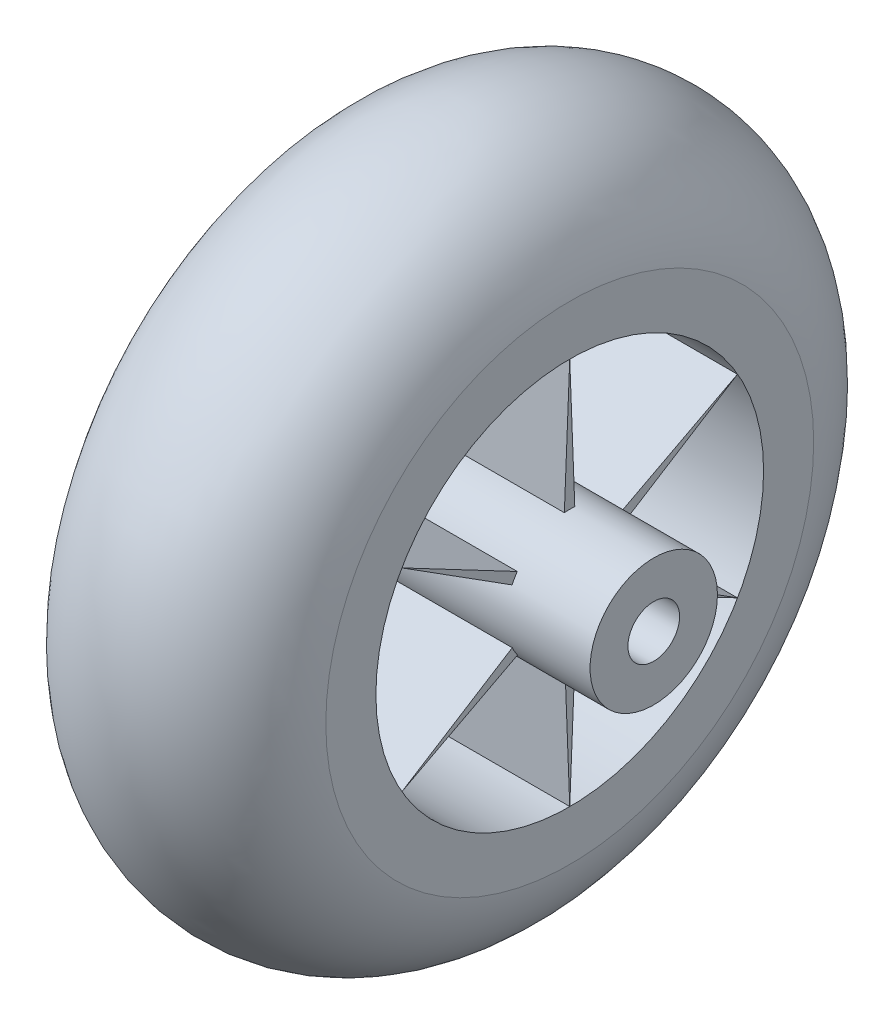
ISO-10303-21;
HEADER;
FILE_DESCRIPTION(('STEP AP214'),'2;1');
FILE_NAME('part.step','',(''),(''),'','','');
FILE_SCHEMA(('AUTOMOTIVE_DESIGN { 1 0 10303 214 1 1 1 1 }'));
ENDSEC;
DATA;
#1=APPLICATION_CONTEXT('core data for automotive mechanical design processes');
#2=APPLICATION_PROTOCOL_DEFINITION('international standard','automotive_design',2000,#1);
#3=PRODUCT_CONTEXT('',#1,'mechanical');
#4=PRODUCT('Part','Part','',(#3));
#5=PRODUCT_RELATED_PRODUCT_CATEGORY('part','',(#4));
#6=PRODUCT_DEFINITION_FORMATION('','',#4);
#7=PRODUCT_DEFINITION_CONTEXT('part definition',#1,'design');
#8=PRODUCT_DEFINITION('design','',#6,#7);
#9=PRODUCT_DEFINITION_SHAPE('','',#8);
#10=(LENGTH_UNIT() NAMED_UNIT(*) SI_UNIT(.MILLI.,.METRE.));
#11=(NAMED_UNIT(*) PLANE_ANGLE_UNIT() SI_UNIT($,.RADIAN.));
#12=(NAMED_UNIT(*) SI_UNIT($,.STERADIAN.) SOLID_ANGLE_UNIT());
#13=UNCERTAINTY_MEASURE_WITH_UNIT(LENGTH_MEASURE(1.E-05),#10,'distance_accuracy_value','');
#14=(GEOMETRIC_REPRESENTATION_CONTEXT(3) GLOBAL_UNCERTAINTY_ASSIGNED_CONTEXT((#13)) GLOBAL_UNIT_ASSIGNED_CONTEXT((#10,
#11,#12)) REPRESENTATION_CONTEXT('',''));
#15=CARTESIAN_POINT('',(0.,0.,0.));
#16=DIRECTION('',(0.,0.,1.));
#17=DIRECTION('',(1.,0.,0.));
#18=AXIS2_PLACEMENT_3D('',#15,#16,#17);
#19=CARTESIAN_POINT('',(0.,-21.,0.));
#20=DIRECTION('',(1.,0.,0.));
#21=DIRECTION('',(0.,0.,-1.));
#22=AXIS2_PLACEMENT_3D('',#19,#20,#21);
#23=CYLINDRICAL_SURFACE('',#22,6.9);
#24=DIRECTION('',(1.,0.,0.));
#25=VECTOR('',#24,1.);
#26=CARTESIAN_POINT('',(0.,-17.0879090937191,5.6837966836433));
#27=LINE('',#26,#25);
#28=CARTESIAN_POINT('',(26.6,-17.0879090937191,5.6837966836433));
#29=VERTEX_POINT('',#28);
#30=CARTESIAN_POINT('',(0.,-17.0879090937191,5.6837966836433));
#31=VERTEX_POINT('',#30);
#32=EDGE_CURVE('E179',#29,#31,#27,.F.);
#33=ORIENTED_EDGE('',*,*,#32,.F.);
#34=CARTESIAN_POINT('',(26.6,-21.,0.));
#35=DIRECTION('',(-1.,0.,0.));
#36=DIRECTION('',(0.,0.,1.));
#37=AXIS2_PLACEMENT_3D('',#34,#35,#36);
#38=CIRCLE('',#37,6.9);
#39=CARTESIAN_POINT('',(26.6,-18.0686754302461,6.24638585637784));
#40=VERTEX_POINT('',#39);
#41=EDGE_CURVE('E12',#29,#40,#38,.F.);
#42=ORIENTED_EDGE('',*,*,#41,.T.);
#43=DIRECTION('',(1.,0.,0.));
#44=VECTOR('',#43,1.);
#45=CARTESIAN_POINT('',(0.,-18.0686754302461,6.24638585637784));
#46=LINE('',#45,#44);
#47=CARTESIAN_POINT('',(0.,-18.0686754302461,6.24638585637784));
#48=VERTEX_POINT('',#47);
#49=EDGE_CURVE('E189',#48,#40,#46,.T.);
#50=ORIENTED_EDGE('',*,*,#49,.F.);
#51=CARTESIAN_POINT('',(0.,-21.,0.));
#52=DIRECTION('',(1.,0.,0.));
#53=DIRECTION('',(0.,0.,-1.));
#54=AXIS2_PLACEMENT_3D('',#51,#52,#53);
#55=CIRCLE('',#54,6.9);
#56=CARTESIAN_POINT('',(0.,-23.9662668648404,6.22986844857496));
#57=VERTEX_POINT('',#56);
#58=EDGE_CURVE('E194',#48,#57,#55,.T.);
#59=ORIENTED_EDGE('',*,*,#58,.T.);
#60=DIRECTION('',(1.,0.,0.));
#61=VECTOR('',#60,1.);
#62=CARTESIAN_POINT('',(0.,-23.9662668648404,6.22986844857496));
#63=LINE('',#62,#61);
#64=CARTESIAN_POINT('',(26.6,-23.9662668648404,6.22986844857496));
#65=VERTEX_POINT('',#64);
#66=EDGE_CURVE('E214',#65,#57,#63,.F.);
#67=ORIENTED_EDGE('',*,*,#66,.F.);
#68=CARTESIAN_POINT('',(26.6,-21.,0.));
#69=DIRECTION('',(-1.,0.,0.));
#70=DIRECTION('',(0.,0.,1.));
#71=AXIS2_PLACEMENT_3D('',#68,#69,#70);
#72=CIRCLE('',#71,6.9);
#73=CARTESIAN_POINT('',(26.6,-24.9438665485861,5.66179447233328));
#74=VERTEX_POINT('',#73);
#75=EDGE_CURVE('E56',#65,#74,#72,.F.);
#76=ORIENTED_EDGE('',*,*,#75,.T.);
#77=DIRECTION('',(1.,0.,0.));
#78=VECTOR('',#77,1.);
#79=CARTESIAN_POINT('',(0.,-24.9438665485861,5.66179447233328));
#80=LINE('',#79,#78);
#81=CARTESIAN_POINT('',(0.,-24.9438665485861,5.66179447233328));
#82=VERTEX_POINT('',#81);
#83=EDGE_CURVE('E212',#82,#74,#80,.T.);
#84=ORIENTED_EDGE('',*,*,#83,.F.);
#85=CARTESIAN_POINT('',(0.,-27.8783577711213,0.546071764931592));
#86=VERTEX_POINT('',#85);
#87=EDGE_CURVE('E323',#82,#86,#55,.T.);
#88=ORIENTED_EDGE('',*,*,#87,.T.);
#89=DIRECTION('',(1.,0.,0.));
#90=VECTOR('',#89,1.);
#91=CARTESIAN_POINT('',(0.,-27.8783577711213,0.546071764931592));
#92=LINE('',#91,#90);
#93=CARTESIAN_POINT('',(26.6,-27.8783577711213,0.546071764931592));
#94=VERTEX_POINT('',#93);
#95=EDGE_CURVE('E231',#94,#86,#92,.F.);
#96=ORIENTED_EDGE('',*,*,#95,.F.);
#97=CARTESIAN_POINT('',(26.6,-21.,0.));
#98=DIRECTION('',(-1.,0.,0.));
#99=DIRECTION('',(0.,0.,1.));
#100=AXIS2_PLACEMENT_3D('',#97,#98,#99);
#101=CIRCLE('',#100,6.9);
#102=CARTESIAN_POINT('',(26.6,-27.87519111834,-0.584591384044622));
#103=VERTEX_POINT('',#102);
#104=EDGE_CURVE('E306',#94,#103,#101,.F.);
#105=ORIENTED_EDGE('',*,*,#104,.T.);
#106=DIRECTION('',(1.,0.,0.));
#107=VECTOR('',#106,1.);
#108=CARTESIAN_POINT('',(0.,-27.87519111834,-0.584591384044622));
#109=LINE('',#108,#107);
#110=CARTESIAN_POINT('',(0.,-27.87519111834,-0.584591384044622));
#111=VERTEX_POINT('',#110);
#112=EDGE_CURVE('E228',#111,#103,#109,.T.);
#113=ORIENTED_EDGE('',*,*,#112,.F.);
#114=CARTESIAN_POINT('',(0.,-24.9120909062808,-5.68379668364332));
#115=VERTEX_POINT('',#114);
#116=EDGE_CURVE('E326',#111,#115,#55,.T.);
#117=ORIENTED_EDGE('',*,*,#116,.T.);
#118=DIRECTION('',(1.,0.,0.));
#119=VECTOR('',#118,1.);
#120=CARTESIAN_POINT('',(0.,-24.9120909062808,-5.68379668364332));
#121=LINE('',#120,#119);
#122=CARTESIAN_POINT('',(26.6,-24.9120909062808,-5.68379668364332));
#123=VERTEX_POINT('',#122);
#124=EDGE_CURVE('E248',#123,#115,#121,.F.);
#125=ORIENTED_EDGE('',*,*,#124,.F.);
#126=CARTESIAN_POINT('',(26.6,-21.,0.));
#127=DIRECTION('',(-1.,0.,0.));
#128=DIRECTION('',(0.,0.,1.));
#129=AXIS2_PLACEMENT_3D('',#126,#127,#128);
#130=CIRCLE('',#129,6.9);
#131=CARTESIAN_POINT('',(26.6,-23.9313245697539,-6.24638585637786));
#132=VERTEX_POINT('',#131);
#133=EDGE_CURVE('E303',#123,#132,#130,.F.);
#134=ORIENTED_EDGE('',*,*,#133,.T.);
#135=DIRECTION('',(1.,0.,0.));
#136=VECTOR('',#135,1.);
#137=CARTESIAN_POINT('',(0.,-23.9313245697539,-6.24638585637785));
#138=LINE('',#137,#136);
#139=CARTESIAN_POINT('',(0.,-23.9313245697539,-6.24638585637785));
#140=VERTEX_POINT('',#139);
#141=EDGE_CURVE('E245',#140,#132,#138,.T.);
#142=ORIENTED_EDGE('',*,*,#141,.F.);
#143=CARTESIAN_POINT('',(0.,-18.0337331351595,-6.22986844857494));
#144=VERTEX_POINT('',#143);
#145=EDGE_CURVE('E327',#140,#144,#55,.T.);
#146=ORIENTED_EDGE('',*,*,#145,.T.);
#147=DIRECTION('',(1.,0.,0.));
#148=VECTOR('',#147,1.);
#149=CARTESIAN_POINT('',(0.,-18.0337331351595,-6.22986844857494));
#150=LINE('',#149,#148);
#151=CARTESIAN_POINT('',(26.6,-18.0337331351595,-6.22986844857494));
#152=VERTEX_POINT('',#151);
#153=EDGE_CURVE('E265',#152,#144,#150,.F.);
#154=ORIENTED_EDGE('',*,*,#153,.F.);
#155=CARTESIAN_POINT('',(26.6,-21.,0.));
#156=DIRECTION('',(-1.,0.,0.));
#157=DIRECTION('',(0.,0.,1.));
#158=AXIS2_PLACEMENT_3D('',#155,#156,#157);
#159=CIRCLE('',#158,6.9);
#160=CARTESIAN_POINT('',(26.6,-17.0561334514139,-5.66179447233326));
#161=VERTEX_POINT('',#160);
#162=EDGE_CURVE('E300',#152,#161,#159,.F.);
#163=ORIENTED_EDGE('',*,*,#162,.T.);
#164=DIRECTION('',(1.,0.,0.));
#165=VECTOR('',#164,1.);
#166=CARTESIAN_POINT('',(0.,-17.0561334514139,-5.66179447233326));
#167=LINE('',#166,#165);
#168=CARTESIAN_POINT('',(0.,-17.0561334514139,-5.66179447233326));
#169=VERTEX_POINT('',#168);
#170=EDGE_CURVE('E262',#169,#161,#167,.T.);
#171=ORIENTED_EDGE('',*,*,#170,.F.);
#172=CARTESIAN_POINT('',(0.,-14.1216422288787,-0.546071764931592));
#173=VERTEX_POINT('',#172);
#174=EDGE_CURVE('E294',#169,#173,#55,.T.);
#175=ORIENTED_EDGE('',*,*,#174,.T.);
#176=DIRECTION('',(1.,0.,0.));
#177=VECTOR('',#176,1.);
#178=CARTESIAN_POINT('',(0.,-14.1216422288787,-0.546071764931592));
#179=LINE('',#178,#177);
#180=CARTESIAN_POINT('',(26.6,-14.1216422288787,-0.546071764931592));
#181=VERTEX_POINT('',#180);
#182=EDGE_CURVE('E282',#181,#173,#179,.F.);
#183=ORIENTED_EDGE('',*,*,#182,.F.);
#184=CARTESIAN_POINT('',(26.6,-21.,0.));
#185=DIRECTION('',(-1.,0.,0.));
#186=DIRECTION('',(0.,0.,1.));
#187=AXIS2_PLACEMENT_3D('',#184,#185,#186);
#188=CIRCLE('',#187,6.9);
#189=CARTESIAN_POINT('',(26.6,-14.12480888166,0.584591384044622));
#190=VERTEX_POINT('',#189);
#191=EDGE_CURVE('E297',#181,#190,#188,.F.);
#192=ORIENTED_EDGE('',*,*,#191,.T.);
#193=DIRECTION('',(1.,0.,0.));
#194=VECTOR('',#193,1.);
#195=CARTESIAN_POINT('',(0.,-14.12480888166,0.584591384044622));
#196=LINE('',#195,#194);
#197=CARTESIAN_POINT('',(0.,-14.12480888166,0.584591384044622));
#198=VERTEX_POINT('',#197);
#199=EDGE_CURVE('E279',#198,#190,#196,.T.);
#200=ORIENTED_EDGE('',*,*,#199,.F.);
#201=EDGE_CURVE('E295',#198,#31,#55,.T.);
#202=ORIENTED_EDGE('',*,*,#201,.T.);
#203=EDGE_LOOP('',(#33,#42,#50,#59,#67,#76,#84,#88,#96,#105,#113,#117,#125,#134,#142,#146,#154,
#163,#171,#175,#183,#192,#200,#202));
#204=FACE_BOUND('',#203,.T.);
#205=CARTESIAN_POINT('',(35.7,-21.,0.));
#206=DIRECTION('',(1.,0.,0.));
#207=DIRECTION('',(0.,0.,-1.));
#208=AXIS2_PLACEMENT_3D('',#205,#206,#207);
#209=CIRCLE('',#208,6.9);
#210=CARTESIAN_POINT('',(35.7,-21.,-6.9));
#211=VERTEX_POINT('',#210);
#212=EDGE_CURVE('E289',#211,#211,#209,.T.);
#213=ORIENTED_EDGE('',*,*,#212,.F.);
#214=EDGE_LOOP('',(#213));
#215=FACE_BOUND('',#214,.T.);
#216=ADVANCED_FACE('F49',(#204,#215),#23,.T.);
#217=CARTESIAN_POINT('',(0.,-21.,0.));
#218=DIRECTION('',(1.,0.,0.));
#219=DIRECTION('',(0.,0.,-1.));
#220=AXIS2_PLACEMENT_3D('',#217,#218,#219);
#221=PLANE('',#220);
#222=ORIENTED_EDGE('',*,*,#58,.F.);
#223=DIRECTION('',(0.,-0.535384337110098,-0.844608555235608));
#224=VECTOR('',#223,1.);
#225=CARTESIAN_POINT('',(0.,-10.4999999999998,18.1865334794731));
#226=LINE('',#225,#224);
#227=CARTESIAN_POINT('',(0.,-10.4999999999998,18.1865334794731));
#228=VERTEX_POINT('',#227);
#229=EDGE_CURVE('E184',#228,#48,#226,.T.);
#230=ORIENTED_EDGE('',*,*,#229,.F.);
#231=DIRECTION('',(0.,0.466163144891677,0.88469877491986));
#232=VECTOR('',#231,1.);
#233=CARTESIAN_POINT('',(0.,-10.4999999999998,18.1865334794731));
#234=LINE('',#233,#232);
#235=EDGE_CURVE('E173',#31,#228,#234,.T.);
#236=ORIENTED_EDGE('',*,*,#235,.F.);
#237=ORIENTED_EDGE('',*,*,#201,.F.);
#238=DIRECTION('',(0.,-0.999144633642758,0.0413521591078215));
#239=VECTOR('',#238,1.);
#240=CARTESIAN_POINT('',(0.,0.,0.));
#241=LINE('',#240,#239);
#242=CARTESIAN_POINT('',(0.,0.,0.));
#243=VERTEX_POINT('',#242);
#244=EDGE_CURVE('E271',#243,#198,#241,.T.);
#245=ORIENTED_EDGE('',*,*,#244,.F.);
#246=DIRECTION('',(0.,0.999253186223408,0.0386402616757032));
#247=VECTOR('',#246,1.);
#248=CARTESIAN_POINT('',(0.,0.,0.));
#249=LINE('',#248,#247);
#250=EDGE_CURVE('E269',#173,#243,#249,.T.);
#251=ORIENTED_EDGE('',*,*,#250,.F.);
#252=ORIENTED_EDGE('',*,*,#174,.F.);
#253=DIRECTION('',(0.,-0.463760296532668,0.885960714343437));
#254=VECTOR('',#253,1.);
#255=CARTESIAN_POINT('',(0.,-10.5,-18.1865334794732));
#256=LINE('',#255,#254);
#257=CARTESIAN_POINT('',(0.,-10.5,-18.1865334794732));
#258=VERTEX_POINT('',#257);
#259=EDGE_CURVE('E254',#258,#169,#256,.T.);
#260=ORIENTED_EDGE('',*,*,#259,.F.);
#261=DIRECTION('',(0.,0.533090041331739,-0.846058513244164));
#262=VECTOR('',#261,1.);
#263=CARTESIAN_POINT('',(0.,-10.5,-18.1865334794732));
#264=LINE('',#263,#262);
#265=EDGE_CURVE('E252',#144,#258,#264,.T.);
#266=ORIENTED_EDGE('',*,*,#265,.F.);
#267=ORIENTED_EDGE('',*,*,#145,.F.);
#268=DIRECTION('',(0.,0.535384337110093,0.844608555235612));
#269=VECTOR('',#268,1.);
#270=CARTESIAN_POINT('',(0.,-31.5000000000001,-18.1865334794732));
#271=LINE('',#270,#269);
#272=CARTESIAN_POINT('',(0.,-31.5000000000001,-18.1865334794732));
#273=VERTEX_POINT('',#272);
#274=EDGE_CURVE('E237',#273,#140,#271,.T.);
#275=ORIENTED_EDGE('',*,*,#274,.F.);
#276=DIRECTION('',(0.,-0.466163144891671,-0.884698774919863));
#277=VECTOR('',#276,1.);
#278=CARTESIAN_POINT('',(0.,-31.5000000000001,-18.1865334794732));
#279=LINE('',#278,#277);
#280=EDGE_CURVE('E235',#115,#273,#279,.T.);
#281=ORIENTED_EDGE('',*,*,#280,.F.);
#282=ORIENTED_EDGE('',*,*,#116,.F.);
#283=DIRECTION('',(0.,0.999144633642758,-0.0413521591078215));
#284=VECTOR('',#283,1.);
#285=CARTESIAN_POINT('',(0.,-42.,0.));
#286=LINE('',#285,#284);
#287=CARTESIAN_POINT('',(0.,-42.,0.));
#288=VERTEX_POINT('',#287);
#289=EDGE_CURVE('E220',#288,#111,#286,.T.);
#290=ORIENTED_EDGE('',*,*,#289,.F.);
#291=DIRECTION('',(0.,-0.999253186223408,-0.0386402616757032));
#292=VECTOR('',#291,1.);
#293=CARTESIAN_POINT('',(0.,-42.,0.));
#294=LINE('',#293,#292);
#295=EDGE_CURVE('E218',#86,#288,#294,.T.);
#296=ORIENTED_EDGE('',*,*,#295,.F.);
#297=ORIENTED_EDGE('',*,*,#87,.F.);
#298=DIRECTION('',(0.,0.463760296532661,-0.88596071434344));
#299=VECTOR('',#298,1.);
#300=CARTESIAN_POINT('',(0.,-31.4999999999998,18.1865334794733));
#301=LINE('',#300,#299);
#302=CARTESIAN_POINT('',(0.,-31.4999999999998,18.1865334794733));
#303=VERTEX_POINT('',#302);
#304=EDGE_CURVE('E205',#303,#82,#301,.T.);
#305=ORIENTED_EDGE('',*,*,#304,.F.);
#306=DIRECTION('',(0.,-0.533090041331733,0.846058513244167));
#307=VECTOR('',#306,1.);
#308=CARTESIAN_POINT('',(0.,-31.4999999999998,18.1865334794733));
#309=LINE('',#308,#307);
#310=EDGE_CURVE('E203',#57,#303,#309,.T.);
#311=ORIENTED_EDGE('',*,*,#310,.F.);
#312=EDGE_LOOP('',(#222,#230,#236,#237,#245,#251,#252,#260,#266,#267,#275,#281,#282,#290,#296,
#297,#305,#311));
#313=FACE_BOUND('',#312,.T.);
#314=ADVANCED_FACE('F192',(#313),#221,.F.);
#315=CARTESIAN_POINT('',(35.7,-21.,0.));
#316=DIRECTION('',(1.,0.,0.));
#317=DIRECTION('',(0.,0.,-1.));
#318=AXIS2_PLACEMENT_3D('',#315,#316,#317);
#319=PLANE('',#318);
#320=CARTESIAN_POINT('',(35.7,-21.,0.));
#321=DIRECTION('',(1.,0.,0.));
#322=DIRECTION('',(0.,0.,-1.));
#323=AXIS2_PLACEMENT_3D('',#320,#321,#322);
#324=CIRCLE('',#323,2.8);
#325=CARTESIAN_POINT('',(35.7,-21.,-2.8));
#326=VERTEX_POINT('',#325);
#327=EDGE_CURVE('E285',#326,#326,#324,.T.);
#328=ORIENTED_EDGE('',*,*,#327,.F.);
#329=EDGE_LOOP('',(#328));
#330=FACE_BOUND('',#329,.T.);
#331=ORIENTED_EDGE('',*,*,#212,.T.);
#332=EDGE_LOOP('',(#331));
#333=FACE_BOUND('',#332,.T.);
#334=ADVANCED_FACE('F365',(#330,#333),#319,.T.);
#335=CARTESIAN_POINT('',(26.6,-21.,0.));
#336=DIRECTION('',(1.,0.,0.));
#337=DIRECTION('',(0.,0.,-1.));
#338=AXIS2_PLACEMENT_3D('',#335,#336,#337);
#339=CYLINDRICAL_SURFACE('',#338,2.8);
#340=CARTESIAN_POINT('',(26.6,-21.,0.));
#341=DIRECTION('',(1.,0.,0.));
#342=DIRECTION('',(0.,0.,-1.));
#343=AXIS2_PLACEMENT_3D('',#340,#341,#342);
#344=CIRCLE('',#343,2.8);
#345=CARTESIAN_POINT('',(26.6,-21.,-2.8));
#346=VERTEX_POINT('',#345);
#347=EDGE_CURVE('E286',#346,#346,#344,.T.);
#348=ORIENTED_EDGE('',*,*,#347,.F.);
#349=EDGE_LOOP('',(#348));
#350=FACE_BOUND('',#349,.T.);
#351=ORIENTED_EDGE('',*,*,#327,.T.);
#352=EDGE_LOOP('',(#351));
#353=FACE_BOUND('',#352,.T.);
#354=ADVANCED_FACE('F369',(#350,#353),#339,.F.);
#355=CARTESIAN_POINT('',(26.6,-21.,0.));
#356=DIRECTION('',(1.,0.,0.));
#357=DIRECTION('',(0.,0.,-1.));
#358=AXIS2_PLACEMENT_3D('',#355,#356,#357);
#359=PLANE('',#358);
#360=ORIENTED_EDGE('',*,*,#347,.T.);
#361=EDGE_LOOP('',(#360));
#362=FACE_BOUND('',#361,.T.);
#363=ADVANCED_FACE('F375',(#362),#359,.T.);
#364=CARTESIAN_POINT('',(0.,0.,0.));
#365=DIRECTION('',(0.,0.0386402616757032,-0.999253186223408));
#366=DIRECTION('',(0.,0.999253186223408,0.0386402616757032));
#367=AXIS2_PLACEMENT_3D('',#364,#365,#366);
#368=PLANE('',#367);
#369=DIRECTION('',(0.,0.999253186223408,0.0386402616757032));
#370=VECTOR('',#369,1.);
#371=CARTESIAN_POINT('',(26.6,0.,0.));
#372=LINE('',#371,#370);
#373=CARTESIAN_POINT('',(26.6,0.,0.));
#374=VERTEX_POINT('',#373);
#375=EDGE_CURVE('E268',#181,#374,#372,.T.);
#376=ORIENTED_EDGE('',*,*,#375,.F.);
#377=ORIENTED_EDGE('',*,*,#182,.T.);
#378=ORIENTED_EDGE('',*,*,#250,.T.);
#379=DIRECTION('',(1.,0.,0.));
#380=VECTOR('',#379,1.);
#381=CARTESIAN_POINT('',(0.,0.,0.));
#382=LINE('',#381,#380);
#383=EDGE_CURVE('E274',#243,#374,#382,.T.);
#384=ORIENTED_EDGE('',*,*,#383,.T.);
#385=EDGE_LOOP('',(#376,#377,#378,#384));
#386=FACE_BOUND('',#385,.T.);
#387=ADVANCED_FACE('F341',(#386),#368,.T.);
#388=CARTESIAN_POINT('',(0.,0.,0.));
#389=DIRECTION('',(0.,0.0413521591078215,0.999144633642758));
#390=DIRECTION('',(0.,-0.999144633642758,0.0413521591078215));
#391=AXIS2_PLACEMENT_3D('',#388,#389,#390);
#392=PLANE('',#391);
#393=ORIENTED_EDGE('',*,*,#244,.T.);
#394=ORIENTED_EDGE('',*,*,#199,.T.);
#395=DIRECTION('',(0.,-0.999144633642758,0.0413521591078215));
#396=VECTOR('',#395,1.);
#397=CARTESIAN_POINT('',(26.6,0.,0.));
#398=LINE('',#397,#396);
#399=EDGE_CURVE('E272',#374,#190,#398,.T.);
#400=ORIENTED_EDGE('',*,*,#399,.F.);
#401=ORIENTED_EDGE('',*,*,#383,.F.);
#402=EDGE_LOOP('',(#393,#394,#400,#401));
#403=FACE_BOUND('',#402,.T.);
#404=ADVANCED_FACE('F346',(#403),#392,.T.);
#405=CARTESIAN_POINT('',(26.6,-20.7386595839758,0.0192438441195656));
#406=DIRECTION('',(-1.,0.,0.));
#407=DIRECTION('',(0.,0.,1.));
#408=AXIS2_PLACEMENT_3D('',#405,#406,#407);
#409=PLANE('',#408);
#410=ORIENTED_EDGE('',*,*,#191,.F.);
#411=ORIENTED_EDGE('',*,*,#375,.T.);
#412=ORIENTED_EDGE('',*,*,#399,.T.);
#413=EDGE_LOOP('',(#410,#411,#412));
#414=FACE_BOUND('',#413,.T.);
#415=ADVANCED_FACE('F349',(#414),#409,.F.);
#416=CARTESIAN_POINT('',(0.,-10.5,-18.1865334794732));
#417=DIRECTION('',(0.,-0.846058513244164,-0.533090041331739));
#418=DIRECTION('',(0.,0.533090041331739,-0.846058513244164));
#419=AXIS2_PLACEMENT_3D('',#416,#417,#418);
#420=PLANE('',#419);
#421=DIRECTION('',(0.,0.533090041331739,-0.846058513244164));
#422=VECTOR('',#421,1.);
#423=CARTESIAN_POINT('',(26.6,-10.5,-18.1865334794732));
#424=LINE('',#423,#422);
#425=CARTESIAN_POINT('',(26.6,-10.5,-18.1865334794732));
#426=VERTEX_POINT('',#425);
#427=EDGE_CURVE('E251',#152,#426,#424,.T.);
#428=ORIENTED_EDGE('',*,*,#427,.F.);
#429=ORIENTED_EDGE('',*,*,#153,.T.);
#430=ORIENTED_EDGE('',*,*,#265,.T.);
#431=DIRECTION('',(1.,0.,0.));
#432=VECTOR('',#431,1.);
#433=CARTESIAN_POINT('',(0.,-10.5,-18.1865334794732));
#434=LINE('',#433,#432);
#435=EDGE_CURVE('E257',#258,#426,#434,.T.);
#436=ORIENTED_EDGE('',*,*,#435,.T.);
#437=EDGE_LOOP('',(#428,#429,#430,#436));
#438=FACE_BOUND('',#437,.T.);
#439=ADVANCED_FACE('F351',(#438),#420,.T.);
#440=CARTESIAN_POINT('',(0.,-10.5,-18.1865334794732));
#441=DIRECTION('',(0.,0.885960714343436,0.463760296532668));
#442=DIRECTION('',(0.,-0.463760296532668,0.885960714343436));
#443=AXIS2_PLACEMENT_3D('',#440,#441,#442);
#444=PLANE('',#443);
#445=ORIENTED_EDGE('',*,*,#259,.T.);
#446=ORIENTED_EDGE('',*,*,#170,.T.);
#447=DIRECTION('',(0.,-0.463760296532668,0.885960714343437));
#448=VECTOR('',#447,1.);
#449=CARTESIAN_POINT('',(26.6,-10.5,-18.1865334794732));
#450=LINE('',#449,#448);
#451=EDGE_CURVE('E255',#426,#161,#450,.T.);
#452=ORIENTED_EDGE('',*,*,#451,.F.);
#453=ORIENTED_EDGE('',*,*,#435,.F.);
#454=EDGE_LOOP('',(#445,#446,#452,#453));
#455=FACE_BOUND('',#454,.T.);
#456=ADVANCED_FACE('F357',(#455),#444,.T.);
#457=CARTESIAN_POINT('',(26.6,-20.8526641341139,-0.216705517252787));
#458=DIRECTION('',(-1.,0.,0.));
#459=DIRECTION('',(0.,0.86602540378444,0.499999999999998));
#460=AXIS2_PLACEMENT_3D('',#457,#458,#459);
#461=PLANE('',#460);
#462=ORIENTED_EDGE('',*,*,#162,.F.);
#463=ORIENTED_EDGE('',*,*,#427,.T.);
#464=ORIENTED_EDGE('',*,*,#451,.T.);
#465=EDGE_LOOP('',(#462,#463,#464));
#466=FACE_BOUND('',#465,.T.);
#467=ADVANCED_FACE('F448',(#466),#461,.F.);
#468=CARTESIAN_POINT('',(0.,-31.5000000000001,-18.1865334794732));
#469=DIRECTION('',(0.,-0.884698774919863,0.466163144891671));
#470=DIRECTION('',(0.,-0.466163144891671,-0.884698774919863));
#471=AXIS2_PLACEMENT_3D('',#468,#469,#470);
#472=PLANE('',#471);
#473=DIRECTION('',(0.,-0.466163144891671,-0.884698774919863));
#474=VECTOR('',#473,1.);
#475=CARTESIAN_POINT('',(26.6,-31.5000000000001,-18.1865334794732));
#476=LINE('',#475,#474);
#477=CARTESIAN_POINT('',(26.6,-31.5000000000001,-18.1865334794732));
#478=VERTEX_POINT('',#477);
#479=EDGE_CURVE('E234',#123,#478,#476,.T.);
#480=ORIENTED_EDGE('',*,*,#479,.F.);
#481=ORIENTED_EDGE('',*,*,#124,.T.);
#482=ORIENTED_EDGE('',*,*,#280,.T.);
#483=DIRECTION('',(1.,0.,0.));
#484=VECTOR('',#483,1.);
#485=CARTESIAN_POINT('',(0.,-31.5000000000001,-18.1865334794732));
#486=LINE('',#485,#484);
#487=EDGE_CURVE('E240',#273,#478,#486,.T.);
#488=ORIENTED_EDGE('',*,*,#487,.T.);
#489=EDGE_LOOP('',(#480,#481,#482,#488));
#490=FACE_BOUND('',#489,.T.);
#491=ADVANCED_FACE('F443',(#490),#472,.T.);
#492=CARTESIAN_POINT('',(0.,-31.5000000000001,-18.1865334794732));
#493=DIRECTION('',(0.,0.844608555235612,-0.535384337110092));
#494=DIRECTION('',(0.,0.535384337110092,0.844608555235612));
#495=AXIS2_PLACEMENT_3D('',#492,#493,#494);
#496=PLANE('',#495);
#497=ORIENTED_EDGE('',*,*,#274,.T.);
#498=ORIENTED_EDGE('',*,*,#141,.T.);
#499=DIRECTION('',(0.,0.535384337110093,0.844608555235612));
#500=VECTOR('',#499,1.);
#501=CARTESIAN_POINT('',(26.6,-31.5000000000001,-18.1865334794732));
#502=LINE('',#501,#500);
#503=EDGE_CURVE('E238',#478,#132,#502,.T.);
#504=ORIENTED_EDGE('',*,*,#503,.F.);
#505=ORIENTED_EDGE('',*,*,#487,.F.);
#506=EDGE_LOOP('',(#497,#498,#504,#505));
#507=FACE_BOUND('',#506,.T.);
#508=ADVANCED_FACE('F447',(#507),#496,.T.);
#509=CARTESIAN_POINT('',(26.6,-21.1140045501381,-0.235949361372355));
#510=DIRECTION('',(-1.,0.,0.));
#511=DIRECTION('',(0.,0.866025403784436,-0.500000000000004));
#512=AXIS2_PLACEMENT_3D('',#509,#510,#511);
#513=PLANE('',#512);
#514=ORIENTED_EDGE('',*,*,#133,.F.);
#515=ORIENTED_EDGE('',*,*,#479,.T.);
#516=ORIENTED_EDGE('',*,*,#503,.T.);
#517=EDGE_LOOP('',(#514,#515,#516));
#518=FACE_BOUND('',#517,.T.);
#519=ADVANCED_FACE('F433',(#518),#513,.F.);
#520=CARTESIAN_POINT('',(0.,-42.,0.));
#521=DIRECTION('',(0.,-0.0386402616757032,0.999253186223408));
#522=DIRECTION('',(0.,-0.999253186223408,-0.0386402616757032));
#523=AXIS2_PLACEMENT_3D('',#520,#521,#522);
#524=PLANE('',#523);
#525=DIRECTION('',(0.,-0.999253186223408,-0.0386402616757032));
#526=VECTOR('',#525,1.);
#527=CARTESIAN_POINT('',(26.6,-42.,0.));
#528=LINE('',#527,#526);
#529=CARTESIAN_POINT('',(26.6,-42.,0.));
#530=VERTEX_POINT('',#529);
#531=EDGE_CURVE('E217',#94,#530,#528,.T.);
#532=ORIENTED_EDGE('',*,*,#531,.F.);
#533=ORIENTED_EDGE('',*,*,#95,.T.);
#534=ORIENTED_EDGE('',*,*,#295,.T.);
#535=DIRECTION('',(1.,0.,0.));
#536=VECTOR('',#535,1.);
#537=CARTESIAN_POINT('',(0.,-42.,0.));
#538=LINE('',#537,#536);
#539=EDGE_CURVE('E223',#288,#530,#538,.T.);
#540=ORIENTED_EDGE('',*,*,#539,.T.);
#541=EDGE_LOOP('',(#532,#533,#534,#540));
#542=FACE_BOUND('',#541,.T.);
#543=ADVANCED_FACE('F428',(#542),#524,.T.);
#544=CARTESIAN_POINT('',(0.,-42.,0.));
#545=DIRECTION('',(0.,-0.0413521591078215,-0.999144633642758));
#546=DIRECTION('',(0.,0.999144633642758,-0.0413521591078215));
#547=AXIS2_PLACEMENT_3D('',#544,#545,#546);
#548=PLANE('',#547);
#549=ORIENTED_EDGE('',*,*,#289,.T.);
#550=ORIENTED_EDGE('',*,*,#112,.T.);
#551=DIRECTION('',(0.,0.999144633642758,-0.0413521591078215));
#552=VECTOR('',#551,1.);
#553=CARTESIAN_POINT('',(26.6,-42.,0.));
#554=LINE('',#553,#552);
#555=EDGE_CURVE('E221',#530,#103,#554,.T.);
#556=ORIENTED_EDGE('',*,*,#555,.F.);
#557=ORIENTED_EDGE('',*,*,#539,.F.);
#558=EDGE_LOOP('',(#549,#550,#556,#557));
#559=FACE_BOUND('',#558,.T.);
#560=ADVANCED_FACE('F432',(#559),#548,.T.);
#561=CARTESIAN_POINT('',(26.6,-21.2613404160242,-0.0192438441195656));
#562=DIRECTION('',(-1.,0.,0.));
#563=DIRECTION('',(0.,0.,-1.));
#564=AXIS2_PLACEMENT_3D('',#561,#562,#563);
#565=PLANE('',#564);
#566=ORIENTED_EDGE('',*,*,#104,.F.);
#567=ORIENTED_EDGE('',*,*,#531,.T.);
#568=ORIENTED_EDGE('',*,*,#555,.T.);
#569=EDGE_LOOP('',(#566,#567,#568));
#570=FACE_BOUND('',#569,.T.);
#571=ADVANCED_FACE('F419',(#570),#565,.F.);
#572=CARTESIAN_POINT('',(0.,-31.4999999999998,18.1865334794733));
#573=DIRECTION('',(0.,0.846058513244167,0.533090041331733));
#574=DIRECTION('',(0.,-0.533090041331733,0.846058513244167));
#575=AXIS2_PLACEMENT_3D('',#572,#573,#574);
#576=PLANE('',#575);
#577=DIRECTION('',(0.,-0.533090041331733,0.846058513244167));
#578=VECTOR('',#577,1.);
#579=CARTESIAN_POINT('',(26.6,-31.4999999999998,18.1865334794733));
#580=LINE('',#579,#578);
#581=CARTESIAN_POINT('',(26.6,-31.4999999999998,18.1865334794733));
#582=VERTEX_POINT('',#581);
#583=EDGE_CURVE('E202',#65,#582,#580,.T.);
#584=ORIENTED_EDGE('',*,*,#583,.F.);
#585=ORIENTED_EDGE('',*,*,#66,.T.);
#586=ORIENTED_EDGE('',*,*,#310,.T.);
#587=DIRECTION('',(1.,0.,0.));
#588=VECTOR('',#587,1.);
#589=CARTESIAN_POINT('',(0.,-31.4999999999998,18.1865334794733));
#590=LINE('',#589,#588);
#591=EDGE_CURVE('E207',#303,#582,#590,.T.);
#592=ORIENTED_EDGE('',*,*,#591,.T.);
#593=EDGE_LOOP('',(#584,#585,#586,#592));
#594=FACE_BOUND('',#593,.T.);
#595=ADVANCED_FACE('F317',(#594),#576,.T.);
#596=CARTESIAN_POINT('',(0.,-31.4999999999998,18.1865334794733));
#597=DIRECTION('',(0.,-0.88596071434344,-0.463760296532661));
#598=DIRECTION('',(0.,0.463760296532661,-0.88596071434344));
#599=AXIS2_PLACEMENT_3D('',#596,#597,#598);
#600=PLANE('',#599);
#601=ORIENTED_EDGE('',*,*,#304,.T.);
#602=ORIENTED_EDGE('',*,*,#83,.T.);
#603=DIRECTION('',(0.,0.463760296532661,-0.88596071434344));
#604=VECTOR('',#603,1.);
#605=CARTESIAN_POINT('',(26.6,-31.4999999999998,18.1865334794733));
#606=LINE('',#605,#604);
#607=EDGE_CURVE('E71',#582,#74,#606,.T.);
#608=ORIENTED_EDGE('',*,*,#607,.F.);
#609=ORIENTED_EDGE('',*,*,#591,.F.);
#610=EDGE_LOOP('',(#601,#602,#608,#609));
#611=FACE_BOUND('',#610,.T.);
#612=ADVANCED_FACE('F321',(#611),#600,.T.);
#613=CARTESIAN_POINT('',(26.6,-21.1473358658861,0.21670551725279));
#614=DIRECTION('',(-1.,0.,0.));
#615=DIRECTION('',(0.,-0.866025403784443,-0.499999999999992));
#616=AXIS2_PLACEMENT_3D('',#613,#614,#615);
#617=PLANE('',#616);
#618=ORIENTED_EDGE('',*,*,#75,.F.);
#619=ORIENTED_EDGE('',*,*,#583,.T.);
#620=ORIENTED_EDGE('',*,*,#607,.T.);
#621=EDGE_LOOP('',(#618,#619,#620));
#622=FACE_BOUND('',#621,.T.);
#623=ADVANCED_FACE('F315',(#622),#617,.F.);
#624=CARTESIAN_POINT('',(0.,-10.4999999999998,18.1865334794731));
#625=DIRECTION('',(0.,0.88469877491986,-0.466163144891677));
#626=DIRECTION('',(0.,0.466163144891677,0.88469877491986));
#627=AXIS2_PLACEMENT_3D('',#624,#625,#626);
#628=PLANE('',#627);
#629=DIRECTION('',(0.,0.466163144891677,0.88469877491986));
#630=VECTOR('',#629,1.);
#631=CARTESIAN_POINT('',(26.6,-10.4999999999998,18.1865334794731));
#632=LINE('',#631,#630);
#633=CARTESIAN_POINT('',(26.6,-10.4999999999998,18.1865334794731));
#634=VERTEX_POINT('',#633);
#635=EDGE_CURVE('E197',#29,#634,#632,.T.);
#636=ORIENTED_EDGE('',*,*,#635,.F.);
#637=ORIENTED_EDGE('',*,*,#32,.T.);
#638=ORIENTED_EDGE('',*,*,#235,.T.);
#639=DIRECTION('',(1.,0.,0.));
#640=VECTOR('',#639,1.);
#641=CARTESIAN_POINT('',(0.,-10.4999999999998,18.1865334794731));
#642=LINE('',#641,#640);
#643=EDGE_CURVE('E177',#228,#634,#642,.T.);
#644=ORIENTED_EDGE('',*,*,#643,.T.);
#645=EDGE_LOOP('',(#636,#637,#638,#644));
#646=FACE_BOUND('',#645,.T.);
#647=ADVANCED_FACE('F176',(#646),#628,.T.);
#648=CARTESIAN_POINT('',(0.,-10.4999999999998,18.1865334794731));
#649=DIRECTION('',(0.,-0.844608555235608,0.535384337110098));
#650=DIRECTION('',(0.,-0.535384337110098,-0.844608555235608));
#651=AXIS2_PLACEMENT_3D('',#648,#649,#650);
#652=PLANE('',#651);
#653=ORIENTED_EDGE('',*,*,#229,.T.);
#654=ORIENTED_EDGE('',*,*,#49,.T.);
#655=DIRECTION('',(0.,-0.535384337110098,-0.844608555235608));
#656=VECTOR('',#655,1.);
#657=CARTESIAN_POINT('',(26.6,-10.4999999999998,18.1865334794731));
#658=LINE('',#657,#656);
#659=EDGE_CURVE('E63',#634,#40,#658,.T.);
#660=ORIENTED_EDGE('',*,*,#659,.F.);
#661=ORIENTED_EDGE('',*,*,#643,.F.);
#662=EDGE_LOOP('',(#653,#654,#660,#661));
#663=FACE_BOUND('',#662,.T.);
#664=ADVANCED_FACE('F187',(#663),#652,.T.);
#665=CARTESIAN_POINT('',(26.6,-20.8859954498619,0.235949361372355));
#666=DIRECTION('',(-1.,0.,0.));
#667=DIRECTION('',(0.,-0.866025403784433,0.50000000000001));
#668=AXIS2_PLACEMENT_3D('',#665,#666,#667);
#669=PLANE('',#668);
#670=ORIENTED_EDGE('',*,*,#41,.F.);
#671=ORIENTED_EDGE('',*,*,#635,.T.);
#672=ORIENTED_EDGE('',*,*,#659,.T.);
#673=EDGE_LOOP('',(#670,#671,#672));
#674=FACE_BOUND('',#673,.T.);
#675=ADVANCED_FACE('F406',(#674),#669,.F.);
#676=CLOSED_SHELL('',(#216,#314,#334,#354,#363,#387,#404,#415,#439,#456,#467,#491,#508,#519,
#543,#560,#571,#595,#612,#623,#647,#664,#675));
#677=MANIFOLD_SOLID_BREP('B2',#676);
#678=CARTESIAN_POINT('',(0.,0.,0.));
#679=DIRECTION('',(1.,0.,0.));
#680=DIRECTION('',(0.,0.,-1.));
#681=AXIS2_PLACEMENT_3D('',#678,#679,#680);
#682=PLANE('',#681);
#683=CARTESIAN_POINT('',(0.,-21.,0.));
#684=DIRECTION('',(-1.,0.,0.));
#685=DIRECTION('',(0.,0.,1.));
#686=AXIS2_PLACEMENT_3D('',#683,#684,#685);
#687=CIRCLE('',#686,21.);
#688=CARTESIAN_POINT('',(0.,-21.,21.));
#689=VERTEX_POINT('',#688);
#690=EDGE_CURVE('E654',#689,#689,#687,.T.);
#691=ORIENTED_EDGE('',*,*,#690,.F.);
#692=EDGE_LOOP('',(#691));
#693=FACE_BOUND('',#692,.T.);
#694=CARTESIAN_POINT('',(0.,-21.,0.));
#695=DIRECTION('',(-1.,0.,0.));
#696=DIRECTION('',(0.,0.,1.));
#697=AXIS2_PLACEMENT_3D('',#694,#695,#696);
#698=CIRCLE('',#697,26.4255237272436);
#699=CARTESIAN_POINT('',(0.,-21.,26.4255237272436));
#700=VERTEX_POINT('',#699);
#701=EDGE_CURVE('E48',#700,#700,#698,.T.);
#702=ORIENTED_EDGE('',*,*,#701,.T.);
#703=EDGE_LOOP('',(#702));
#704=FACE_BOUND('',#703,.T.);
#705=ADVANCED_FACE('F637',(#693,#704),#682,.F.);
#706=CARTESIAN_POINT('',(13.3,-21.,0.));
#707=DIRECTION('',(-1.,0.,0.));
#708=DIRECTION('',(0.,0.,1.));
#709=AXIS2_PLACEMENT_3D('',#706,#707,#708);
#710=TOROIDAL_SURFACE('',#709,24.3685685000515,13.4581226330671);
#711=ORIENTED_EDGE('',*,*,#701,.F.);
#712=EDGE_LOOP('',(#711));
#713=FACE_BOUND('',#712,.T.);
#714=CARTESIAN_POINT('',(26.6,-21.,0.));
#715=DIRECTION('',(-1.,0.,0.));
#716=DIRECTION('',(0.,0.,1.));
#717=AXIS2_PLACEMENT_3D('',#714,#715,#716);
#718=CIRCLE('',#717,26.4255237272436);
#719=CARTESIAN_POINT('',(26.6,-21.,26.4255237272436));
#720=VERTEX_POINT('',#719);
#721=EDGE_CURVE('E644',#720,#720,#718,.T.);
#722=ORIENTED_EDGE('',*,*,#721,.T.);
#723=EDGE_LOOP('',(#722));
#724=FACE_BOUND('',#723,.T.);
#725=ADVANCED_FACE('F664',(#713,#724),#710,.T.);
#726=CARTESIAN_POINT('',(26.6,0.,0.));
#727=DIRECTION('',(-1.,0.,0.));
#728=DIRECTION('',(0.,0.,1.));
#729=AXIS2_PLACEMENT_3D('',#726,#727,#728);
#730=PLANE('',#729);
#731=ORIENTED_EDGE('',*,*,#721,.F.);
#732=EDGE_LOOP('',(#731));
#733=FACE_BOUND('',#732,.T.);
#734=CARTESIAN_POINT('',(26.6,-21.,0.));
#735=DIRECTION('',(-1.,0.,0.));
#736=DIRECTION('',(0.,0.,1.));
#737=AXIS2_PLACEMENT_3D('',#734,#735,#736);
#738=CIRCLE('',#737,21.);
#739=CARTESIAN_POINT('',(26.6,-21.,21.));
#740=VERTEX_POINT('',#739);
#741=EDGE_CURVE('E649',#740,#740,#738,.T.);
#742=ORIENTED_EDGE('',*,*,#741,.T.);
#743=EDGE_LOOP('',(#742));
#744=FACE_BOUND('',#743,.T.);
#745=ADVANCED_FACE('F668',(#733,#744),#730,.F.);
#746=CARTESIAN_POINT('',(-4.73986639308511,-21.,0.));
#747=DIRECTION('',(-1.,0.,0.));
#748=DIRECTION('',(0.,0.,1.));
#749=AXIS2_PLACEMENT_3D('',#746,#747,#748);
#750=CYLINDRICAL_SURFACE('',#749,21.);
#751=ORIENTED_EDGE('',*,*,#741,.F.);
#752=EDGE_LOOP('',(#751));
#753=FACE_BOUND('',#752,.T.);
#754=ORIENTED_EDGE('',*,*,#690,.T.);
#755=EDGE_LOOP('',(#754));
#756=FACE_BOUND('',#755,.T.);
#757=ADVANCED_FACE('F661',(#753,#756),#750,.F.);
#758=CLOSED_SHELL('',(#705,#725,#745,#757));
#759=MANIFOLD_SOLID_BREP('B6',#758);
#760=ADVANCED_BREP_SHAPE_REPRESENTATION('',(#18,#677,#759),#14);
#761=SHAPE_DEFINITION_REPRESENTATION(#9,#760);
ENDSEC;
END-ISO-10303-21;
